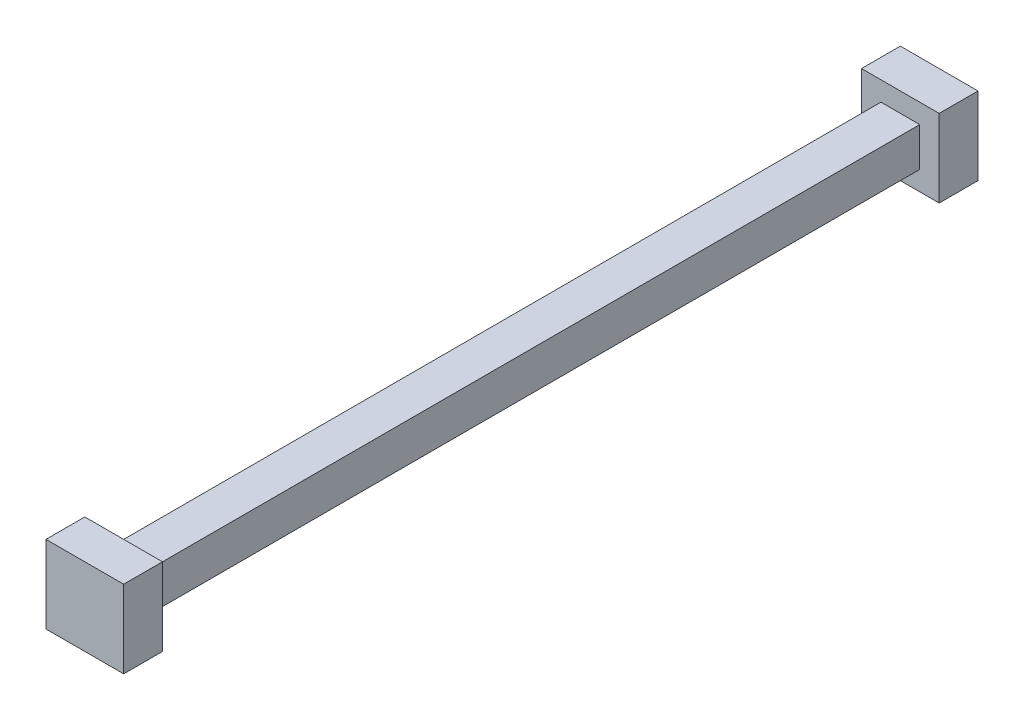
ISO-10303-21;
HEADER;
FILE_DESCRIPTION(('STEP AP214'),'2;1');
FILE_NAME('part.step','',(''),(''),'','','');
FILE_SCHEMA(('AUTOMOTIVE_DESIGN { 1 0 10303 214 1 1 1 1 }'));
ENDSEC;
DATA;
#1=APPLICATION_CONTEXT('core data for automotive mechanical design processes');
#2=APPLICATION_PROTOCOL_DEFINITION('international standard','automotive_design',2000,#1);
#3=PRODUCT_CONTEXT('',#1,'mechanical');
#4=PRODUCT('Part','Part','',(#3));
#5=PRODUCT_RELATED_PRODUCT_CATEGORY('part','',(#4));
#6=PRODUCT_DEFINITION_FORMATION('','',#4);
#7=PRODUCT_DEFINITION_CONTEXT('part definition',#1,'design');
#8=PRODUCT_DEFINITION('design','',#6,#7);
#9=PRODUCT_DEFINITION_SHAPE('','',#8);
#10=(LENGTH_UNIT() NAMED_UNIT(*) SI_UNIT(.MILLI.,.METRE.));
#11=(NAMED_UNIT(*) PLANE_ANGLE_UNIT() SI_UNIT($,.RADIAN.));
#12=(NAMED_UNIT(*) SI_UNIT($,.STERADIAN.) SOLID_ANGLE_UNIT());
#13=UNCERTAINTY_MEASURE_WITH_UNIT(LENGTH_MEASURE(1.E-05),#10,'distance_accuracy_value','');
#14=(GEOMETRIC_REPRESENTATION_CONTEXT(3) GLOBAL_UNCERTAINTY_ASSIGNED_CONTEXT((#13)) GLOBAL_UNIT_ASSIGNED_CONTEXT((#10,
#11,#12)) REPRESENTATION_CONTEXT('',''));
#15=CARTESIAN_POINT('',(0.,0.,0.));
#16=DIRECTION('',(0.,0.,1.));
#17=DIRECTION('',(1.,0.,0.));
#18=AXIS2_PLACEMENT_3D('',#15,#16,#17);
#19=CARTESIAN_POINT('',(5.,-5.,200.));
#20=DIRECTION('',(-1.,0.,0.));
#21=DIRECTION('',(0.,0.,1.));
#22=AXIS2_PLACEMENT_3D('',#19,#20,#21);
#23=PLANE('',#22);
#24=DIRECTION('',(0.,1.,0.));
#25=VECTOR('',#24,1.);
#26=CARTESIAN_POINT('',(5.,-5.,0.));
#27=LINE('',#26,#25);
#28=CARTESIAN_POINT('',(5.,-5.,0.));
#29=VERTEX_POINT('',#28);
#30=CARTESIAN_POINT('',(5.,5.,0.));
#31=VERTEX_POINT('',#30);
#32=EDGE_CURVE('E180',#29,#31,#27,.T.);
#33=ORIENTED_EDGE('',*,*,#32,.T.);
#34=DIRECTION('',(0.,0.,-1.));
#35=VECTOR('',#34,1.);
#36=CARTESIAN_POINT('',(5.,5.,200.));
#37=LINE('',#36,#35);
#38=CARTESIAN_POINT('',(5.,5.,200.));
#39=VERTEX_POINT('',#38);
#40=EDGE_CURVE('E11',#39,#31,#37,.T.);
#41=ORIENTED_EDGE('',*,*,#40,.F.);
#42=DIRECTION('',(0.,1.,0.));
#43=VECTOR('',#42,1.);
#44=CARTESIAN_POINT('',(5.,-5.,200.));
#45=LINE('',#44,#43);
#46=CARTESIAN_POINT('',(5.,-5.,200.));
#47=VERTEX_POINT('',#46);
#48=EDGE_CURVE('E181',#47,#39,#45,.T.);
#49=ORIENTED_EDGE('',*,*,#48,.F.);
#50=DIRECTION('',(0.,0.,-1.));
#51=VECTOR('',#50,1.);
#52=CARTESIAN_POINT('',(5.,-5.,200.));
#53=LINE('',#52,#51);
#54=EDGE_CURVE('E194',#47,#29,#53,.T.);
#55=ORIENTED_EDGE('',*,*,#54,.T.);
#56=EDGE_LOOP('',(#33,#41,#49,#55));
#57=FACE_BOUND('',#56,.T.);
#58=ADVANCED_FACE('F35',(#57),#23,.F.);
#59=CARTESIAN_POINT('',(-5.,5.,200.));
#60=DIRECTION('',(0.,-1.,0.));
#61=DIRECTION('',(0.,0.,-1.));
#62=AXIS2_PLACEMENT_3D('',#59,#60,#61);
#63=PLANE('',#62);
#64=DIRECTION('',(-1.,0.,0.));
#65=VECTOR('',#64,1.);
#66=CARTESIAN_POINT('',(-5.,5.,0.));
#67=LINE('',#66,#65);
#68=CARTESIAN_POINT('',(-5.,5.,0.));
#69=VERTEX_POINT('',#68);
#70=EDGE_CURVE('E197',#31,#69,#67,.T.);
#71=ORIENTED_EDGE('',*,*,#70,.T.);
#72=DIRECTION('',(0.,0.,-1.));
#73=VECTOR('',#72,1.);
#74=CARTESIAN_POINT('',(-5.,5.,200.));
#75=LINE('',#74,#73);
#76=CARTESIAN_POINT('',(-5.,5.,200.));
#77=VERTEX_POINT('',#76);
#78=EDGE_CURVE('E43',#77,#69,#75,.T.);
#79=ORIENTED_EDGE('',*,*,#78,.F.);
#80=DIRECTION('',(-1.,0.,0.));
#81=VECTOR('',#80,1.);
#82=CARTESIAN_POINT('',(-5.,5.,200.));
#83=LINE('',#82,#81);
#84=EDGE_CURVE('E184',#39,#77,#83,.T.);
#85=ORIENTED_EDGE('',*,*,#84,.F.);
#86=ORIENTED_EDGE('',*,*,#40,.T.);
#87=EDGE_LOOP('',(#71,#79,#85,#86));
#88=FACE_BOUND('',#87,.T.);
#89=ADVANCED_FACE('F210',(#88),#63,.F.);
#90=CARTESIAN_POINT('',(-5.,-5.,200.));
#91=DIRECTION('',(1.,0.,0.));
#92=DIRECTION('',(0.,0.,-1.));
#93=AXIS2_PLACEMENT_3D('',#90,#91,#92);
#94=PLANE('',#93);
#95=DIRECTION('',(0.,-1.,0.));
#96=VECTOR('',#95,1.);
#97=CARTESIAN_POINT('',(-5.,-5.,0.));
#98=LINE('',#97,#96);
#99=CARTESIAN_POINT('',(-5.,-5.,0.));
#100=VERTEX_POINT('',#99);
#101=EDGE_CURVE('E200',#69,#100,#98,.T.);
#102=ORIENTED_EDGE('',*,*,#101,.T.);
#103=DIRECTION('',(0.,0.,-1.));
#104=VECTOR('',#103,1.);
#105=CARTESIAN_POINT('',(-5.,-5.,200.));
#106=LINE('',#105,#104);
#107=CARTESIAN_POINT('',(-5.,-5.,200.));
#108=VERTEX_POINT('',#107);
#109=EDGE_CURVE('E50',#108,#100,#106,.T.);
#110=ORIENTED_EDGE('',*,*,#109,.F.);
#111=DIRECTION('',(0.,-1.,0.));
#112=VECTOR('',#111,1.);
#113=CARTESIAN_POINT('',(-5.,-5.,200.));
#114=LINE('',#113,#112);
#115=EDGE_CURVE('E188',#77,#108,#114,.T.);
#116=ORIENTED_EDGE('',*,*,#115,.F.);
#117=ORIENTED_EDGE('',*,*,#78,.T.);
#118=EDGE_LOOP('',(#102,#110,#116,#117));
#119=FACE_BOUND('',#118,.T.);
#120=ADVANCED_FACE('F207',(#119),#94,.F.);
#121=CARTESIAN_POINT('',(-5.,-5.,200.));
#122=DIRECTION('',(0.,1.,0.));
#123=DIRECTION('',(0.,0.,1.));
#124=AXIS2_PLACEMENT_3D('',#121,#122,#123);
#125=PLANE('',#124);
#126=DIRECTION('',(1.,0.,0.));
#127=VECTOR('',#126,1.);
#128=CARTESIAN_POINT('',(-5.,-5.,0.));
#129=LINE('',#128,#127);
#130=EDGE_CURVE('E185',#100,#29,#129,.T.);
#131=ORIENTED_EDGE('',*,*,#130,.T.);
#132=ORIENTED_EDGE('',*,*,#54,.F.);
#133=DIRECTION('',(1.,0.,0.));
#134=VECTOR('',#133,1.);
#135=CARTESIAN_POINT('',(-5.,-5.,200.));
#136=LINE('',#135,#134);
#137=EDGE_CURVE('E191',#108,#47,#136,.T.);
#138=ORIENTED_EDGE('',*,*,#137,.F.);
#139=ORIENTED_EDGE('',*,*,#109,.T.);
#140=EDGE_LOOP('',(#131,#132,#138,#139));
#141=FACE_BOUND('',#140,.T.);
#142=ADVANCED_FACE('F217',(#141),#125,.F.);
#143=CARTESIAN_POINT('',(10.,-10.,210.));
#144=DIRECTION('',(-1.,0.,0.));
#145=DIRECTION('',(0.,0.,1.));
#146=AXIS2_PLACEMENT_3D('',#143,#144,#145);
#147=PLANE('',#146);
#148=DIRECTION('',(0.,1.,0.));
#149=VECTOR('',#148,1.);
#150=CARTESIAN_POINT('',(10.,-10.,200.));
#151=LINE('',#150,#149);
#152=CARTESIAN_POINT('',(10.,-10.,200.));
#153=VERTEX_POINT('',#152);
#154=CARTESIAN_POINT('',(10.,10.,200.));
#155=VERTEX_POINT('',#154);
#156=EDGE_CURVE('E145',#153,#155,#151,.T.);
#157=ORIENTED_EDGE('',*,*,#156,.T.);
#158=DIRECTION('',(0.,0.,-1.));
#159=VECTOR('',#158,1.);
#160=CARTESIAN_POINT('',(10.,10.,210.));
#161=LINE('',#160,#159);
#162=CARTESIAN_POINT('',(10.,10.,210.));
#163=VERTEX_POINT('',#162);
#164=EDGE_CURVE('E177',#163,#155,#161,.T.);
#165=ORIENTED_EDGE('',*,*,#164,.F.);
#166=DIRECTION('',(0.,1.,0.));
#167=VECTOR('',#166,1.);
#168=CARTESIAN_POINT('',(10.,-10.,210.));
#169=LINE('',#168,#167);
#170=CARTESIAN_POINT('',(10.,-10.,210.));
#171=VERTEX_POINT('',#170);
#172=EDGE_CURVE('E154',#171,#163,#169,.T.);
#173=ORIENTED_EDGE('',*,*,#172,.F.);
#174=DIRECTION('',(0.,0.,-1.));
#175=VECTOR('',#174,1.);
#176=CARTESIAN_POINT('',(10.,-10.,210.));
#177=LINE('',#176,#175);
#178=EDGE_CURVE('E163',#171,#153,#177,.T.);
#179=ORIENTED_EDGE('',*,*,#178,.T.);
#180=EDGE_LOOP('',(#157,#165,#173,#179));
#181=FACE_BOUND('',#180,.T.);
#182=ADVANCED_FACE('F230',(#181),#147,.F.);
#183=CARTESIAN_POINT('',(-9.99999999999999,10.,210.));
#184=DIRECTION('',(0.,-1.,0.));
#185=DIRECTION('',(0.,0.,-1.));
#186=AXIS2_PLACEMENT_3D('',#183,#184,#185);
#187=PLANE('',#186);
#188=DIRECTION('',(-1.,0.,0.));
#189=VECTOR('',#188,1.);
#190=CARTESIAN_POINT('',(-9.99999999999999,10.,200.));
#191=LINE('',#190,#189);
#192=CARTESIAN_POINT('',(-9.99999999999999,10.,200.));
#193=VERTEX_POINT('',#192);
#194=EDGE_CURVE('E148',#155,#193,#191,.T.);
#195=ORIENTED_EDGE('',*,*,#194,.T.);
#196=DIRECTION('',(0.,0.,-1.));
#197=VECTOR('',#196,1.);
#198=CARTESIAN_POINT('',(-9.99999999999999,10.,210.));
#199=LINE('',#198,#197);
#200=CARTESIAN_POINT('',(-9.99999999999999,10.,210.));
#201=VERTEX_POINT('',#200);
#202=EDGE_CURVE('E174',#201,#193,#199,.T.);
#203=ORIENTED_EDGE('',*,*,#202,.F.);
#204=DIRECTION('',(-1.,0.,0.));
#205=VECTOR('',#204,1.);
#206=CARTESIAN_POINT('',(-9.99999999999999,10.,210.));
#207=LINE('',#206,#205);
#208=EDGE_CURVE('E157',#163,#201,#207,.T.);
#209=ORIENTED_EDGE('',*,*,#208,.F.);
#210=ORIENTED_EDGE('',*,*,#164,.T.);
#211=EDGE_LOOP('',(#195,#203,#209,#210));
#212=FACE_BOUND('',#211,.T.);
#213=ADVANCED_FACE('F242',(#212),#187,.F.);
#214=CARTESIAN_POINT('',(-9.99999999999999,-10.,210.));
#215=DIRECTION('',(1.,0.,0.));
#216=DIRECTION('',(0.,0.,-1.));
#217=AXIS2_PLACEMENT_3D('',#214,#215,#216);
#218=PLANE('',#217);
#219=DIRECTION('',(0.,-1.,0.));
#220=VECTOR('',#219,1.);
#221=CARTESIAN_POINT('',(-9.99999999999999,-10.,200.));
#222=LINE('',#221,#220);
#223=CARTESIAN_POINT('',(-9.99999999999999,-10.,200.));
#224=VERTEX_POINT('',#223);
#225=EDGE_CURVE('E166',#193,#224,#222,.T.);
#226=ORIENTED_EDGE('',*,*,#225,.T.);
#227=DIRECTION('',(0.,0.,-1.));
#228=VECTOR('',#227,1.);
#229=CARTESIAN_POINT('',(-9.99999999999999,-10.,210.));
#230=LINE('',#229,#228);
#231=CARTESIAN_POINT('',(-9.99999999999999,-10.,210.));
#232=VERTEX_POINT('',#231);
#233=EDGE_CURVE('E171',#232,#224,#230,.T.);
#234=ORIENTED_EDGE('',*,*,#233,.F.);
#235=DIRECTION('',(0.,-1.,0.));
#236=VECTOR('',#235,1.);
#237=CARTESIAN_POINT('',(-9.99999999999999,-10.,210.));
#238=LINE('',#237,#236);
#239=EDGE_CURVE('E160',#201,#232,#238,.T.);
#240=ORIENTED_EDGE('',*,*,#239,.F.);
#241=ORIENTED_EDGE('',*,*,#202,.T.);
#242=EDGE_LOOP('',(#226,#234,#240,#241));
#243=FACE_BOUND('',#242,.T.);
#244=ADVANCED_FACE('F239',(#243),#218,.F.);
#245=CARTESIAN_POINT('',(-9.99999999999999,-10.,210.));
#246=DIRECTION('',(0.,1.,0.));
#247=DIRECTION('',(0.,0.,1.));
#248=AXIS2_PLACEMENT_3D('',#245,#246,#247);
#249=PLANE('',#248);
#250=DIRECTION('',(1.,0.,0.));
#251=VECTOR('',#250,1.);
#252=CARTESIAN_POINT('',(-9.99999999999999,-10.,200.));
#253=LINE('',#252,#251);
#254=EDGE_CURVE('E158',#224,#153,#253,.T.);
#255=ORIENTED_EDGE('',*,*,#254,.T.);
#256=ORIENTED_EDGE('',*,*,#178,.F.);
#257=DIRECTION('',(1.,0.,0.));
#258=VECTOR('',#257,1.);
#259=CARTESIAN_POINT('',(-9.99999999999999,-10.,210.));
#260=LINE('',#259,#258);
#261=EDGE_CURVE('E162',#232,#171,#260,.T.);
#262=ORIENTED_EDGE('',*,*,#261,.F.);
#263=ORIENTED_EDGE('',*,*,#233,.T.);
#264=EDGE_LOOP('',(#255,#256,#262,#263));
#265=FACE_BOUND('',#264,.T.);
#266=ADVANCED_FACE('F235',(#265),#249,.F.);
#267=CARTESIAN_POINT('',(0.,0.,210.));
#268=DIRECTION('',(0.,0.,-1.));
#269=DIRECTION('',(-1.,0.,0.));
#270=AXIS2_PLACEMENT_3D('',#267,#268,#269);
#271=PLANE('',#270);
#272=ORIENTED_EDGE('',*,*,#172,.T.);
#273=ORIENTED_EDGE('',*,*,#208,.T.);
#274=ORIENTED_EDGE('',*,*,#239,.T.);
#275=ORIENTED_EDGE('',*,*,#261,.T.);
#276=EDGE_LOOP('',(#272,#273,#274,#275));
#277=FACE_BOUND('',#276,.T.);
#278=ADVANCED_FACE('F223',(#277),#271,.F.);
#279=CARTESIAN_POINT('',(0.,0.,200.));
#280=DIRECTION('',(0.,0.,-1.));
#281=DIRECTION('',(-1.,0.,0.));
#282=AXIS2_PLACEMENT_3D('',#279,#280,#281);
#283=PLANE('',#282);
#284=ORIENTED_EDGE('',*,*,#137,.T.);
#285=ORIENTED_EDGE('',*,*,#48,.T.);
#286=ORIENTED_EDGE('',*,*,#84,.T.);
#287=ORIENTED_EDGE('',*,*,#115,.T.);
#288=EDGE_LOOP('',(#284,#285,#286,#287));
#289=FACE_BOUND('',#288,.T.);
#290=ORIENTED_EDGE('',*,*,#156,.F.);
#291=ORIENTED_EDGE('',*,*,#254,.F.);
#292=ORIENTED_EDGE('',*,*,#225,.F.);
#293=ORIENTED_EDGE('',*,*,#194,.F.);
#294=EDGE_LOOP('',(#290,#291,#292,#293));
#295=FACE_BOUND('',#294,.T.);
#296=ADVANCED_FACE('F220',(#289,#295),#283,.T.);
#297=CARTESIAN_POINT('',(-10.,10.,-10.));
#298=DIRECTION('',(1.,0.,0.));
#299=DIRECTION('',(0.,1.,0.));
#300=AXIS2_PLACEMENT_3D('',#297,#298,#299);
#301=PLANE('',#300);
#302=DIRECTION('',(0.,1.,0.));
#303=VECTOR('',#302,1.);
#304=CARTESIAN_POINT('',(-10.,10.,0.));
#305=LINE('',#304,#303);
#306=CARTESIAN_POINT('',(-10.,-10.,0.));
#307=VERTEX_POINT('',#306);
#308=CARTESIAN_POINT('',(-10.,10.,0.));
#309=VERTEX_POINT('',#308);
#310=EDGE_CURVE('E144',#307,#309,#305,.T.);
#311=ORIENTED_EDGE('',*,*,#310,.T.);
#312=DIRECTION('',(0.,0.,1.));
#313=VECTOR('',#312,1.);
#314=CARTESIAN_POINT('',(-10.,10.,-10.));
#315=LINE('',#314,#313);
#316=CARTESIAN_POINT('',(-10.,10.,-10.));
#317=VERTEX_POINT('',#316);
#318=EDGE_CURVE('E124',#317,#309,#315,.T.);
#319=ORIENTED_EDGE('',*,*,#318,.F.);
#320=DIRECTION('',(0.,1.,0.));
#321=VECTOR('',#320,1.);
#322=CARTESIAN_POINT('',(-10.,10.,-10.));
#323=LINE('',#322,#321);
#324=CARTESIAN_POINT('',(-10.,-10.,-10.));
#325=VERTEX_POINT('',#324);
#326=EDGE_CURVE('E131',#325,#317,#323,.T.);
#327=ORIENTED_EDGE('',*,*,#326,.F.);
#328=DIRECTION('',(0.,0.,1.));
#329=VECTOR('',#328,1.);
#330=CARTESIAN_POINT('',(-10.,-10.,-10.));
#331=LINE('',#330,#329);
#332=EDGE_CURVE('E363',#325,#307,#331,.T.);
#333=ORIENTED_EDGE('',*,*,#332,.T.);
#334=EDGE_LOOP('',(#311,#319,#327,#333));
#335=FACE_BOUND('',#334,.T.);
#336=ADVANCED_FACE('F142',(#335),#301,.F.);
#337=CARTESIAN_POINT('',(10.,10.,-10.));
#338=DIRECTION('',(0.,-1.,0.));
#339=DIRECTION('',(0.,0.,-1.));
#340=AXIS2_PLACEMENT_3D('',#337,#338,#339);
#341=PLANE('',#340);
#342=DIRECTION('',(1.,0.,0.));
#343=VECTOR('',#342,1.);
#344=CARTESIAN_POINT('',(10.,10.,0.));
#345=LINE('',#344,#343);
#346=CARTESIAN_POINT('',(10.,10.,0.));
#347=VERTEX_POINT('',#346);
#348=EDGE_CURVE('E369',#309,#347,#345,.T.);
#349=ORIENTED_EDGE('',*,*,#348,.T.);
#350=DIRECTION('',(0.,0.,1.));
#351=VECTOR('',#350,1.);
#352=CARTESIAN_POINT('',(10.,10.,-10.));
#353=LINE('',#352,#351);
#354=CARTESIAN_POINT('',(10.,10.,-10.));
#355=VERTEX_POINT('',#354);
#356=EDGE_CURVE('E127',#355,#347,#353,.T.);
#357=ORIENTED_EDGE('',*,*,#356,.F.);
#358=DIRECTION('',(1.,0.,0.));
#359=VECTOR('',#358,1.);
#360=CARTESIAN_POINT('',(10.,10.,-10.));
#361=LINE('',#360,#359);
#362=EDGE_CURVE('E120',#317,#355,#361,.T.);
#363=ORIENTED_EDGE('',*,*,#362,.F.);
#364=ORIENTED_EDGE('',*,*,#318,.T.);
#365=EDGE_LOOP('',(#349,#357,#363,#364));
#366=FACE_BOUND('',#365,.T.);
#367=ADVANCED_FACE('F122',(#366),#341,.F.);
#368=CARTESIAN_POINT('',(10.,10.,-10.));
#369=DIRECTION('',(-1.,0.,0.));
#370=DIRECTION('',(0.,-1.,0.));
#371=AXIS2_PLACEMENT_3D('',#368,#369,#370);
#372=PLANE('',#371);
#373=DIRECTION('',(0.,-1.,0.));
#374=VECTOR('',#373,1.);
#375=CARTESIAN_POINT('',(10.,10.,0.));
#376=LINE('',#375,#374);
#377=CARTESIAN_POINT('',(10.,-10.,0.));
#378=VERTEX_POINT('',#377);
#379=EDGE_CURVE('E366',#347,#378,#376,.T.);
#380=ORIENTED_EDGE('',*,*,#379,.T.);
#381=DIRECTION('',(0.,0.,1.));
#382=VECTOR('',#381,1.);
#383=CARTESIAN_POINT('',(10.,-10.,-10.));
#384=LINE('',#383,#382);
#385=CARTESIAN_POINT('',(10.,-10.,-10.));
#386=VERTEX_POINT('',#385);
#387=EDGE_CURVE('E150',#386,#378,#384,.T.);
#388=ORIENTED_EDGE('',*,*,#387,.F.);
#389=DIRECTION('',(0.,-1.,0.));
#390=VECTOR('',#389,1.);
#391=CARTESIAN_POINT('',(10.,10.,-10.));
#392=LINE('',#391,#390);
#393=EDGE_CURVE('E130',#355,#386,#392,.T.);
#394=ORIENTED_EDGE('',*,*,#393,.F.);
#395=ORIENTED_EDGE('',*,*,#356,.T.);
#396=EDGE_LOOP('',(#380,#388,#394,#395));
#397=FACE_BOUND('',#396,.T.);
#398=ADVANCED_FACE('F322',(#397),#372,.F.);
#399=CARTESIAN_POINT('',(10.,-10.,-10.));
#400=DIRECTION('',(0.,1.,0.));
#401=DIRECTION('',(0.,0.,1.));
#402=AXIS2_PLACEMENT_3D('',#399,#400,#401);
#403=PLANE('',#402);
#404=DIRECTION('',(-1.,0.,0.));
#405=VECTOR('',#404,1.);
#406=CARTESIAN_POINT('',(10.,-10.,0.));
#407=LINE('',#406,#405);
#408=EDGE_CURVE('E140',#378,#307,#407,.T.);
#409=ORIENTED_EDGE('',*,*,#408,.T.);
#410=ORIENTED_EDGE('',*,*,#332,.F.);
#411=DIRECTION('',(-1.,0.,0.));
#412=VECTOR('',#411,1.);
#413=CARTESIAN_POINT('',(10.,-10.,-10.));
#414=LINE('',#413,#412);
#415=EDGE_CURVE('E136',#386,#325,#414,.T.);
#416=ORIENTED_EDGE('',*,*,#415,.F.);
#417=ORIENTED_EDGE('',*,*,#387,.T.);
#418=EDGE_LOOP('',(#409,#410,#416,#417));
#419=FACE_BOUND('',#418,.T.);
#420=ADVANCED_FACE('F331',(#419),#403,.F.);
#421=CARTESIAN_POINT('',(0.,0.,-10.));
#422=DIRECTION('',(0.,0.,-1.));
#423=DIRECTION('',(-1.,0.,0.));
#424=AXIS2_PLACEMENT_3D('',#421,#422,#423);
#425=PLANE('',#424);
#426=ORIENTED_EDGE('',*,*,#326,.T.);
#427=ORIENTED_EDGE('',*,*,#362,.T.);
#428=ORIENTED_EDGE('',*,*,#393,.T.);
#429=ORIENTED_EDGE('',*,*,#415,.T.);
#430=EDGE_LOOP('',(#426,#427,#428,#429));
#431=FACE_BOUND('',#430,.T.);
#432=ADVANCED_FACE('F134',(#431),#425,.T.);
#433=CARTESIAN_POINT('',(0.,0.,0.));
#434=DIRECTION('',(0.,0.,-1.));
#435=DIRECTION('',(-1.,0.,0.));
#436=AXIS2_PLACEMENT_3D('',#433,#434,#435);
#437=PLANE('',#436);
#438=ORIENTED_EDGE('',*,*,#32,.F.);
#439=ORIENTED_EDGE('',*,*,#130,.F.);
#440=ORIENTED_EDGE('',*,*,#101,.F.);
#441=ORIENTED_EDGE('',*,*,#70,.F.);
#442=EDGE_LOOP('',(#438,#439,#440,#441));
#443=FACE_BOUND('',#442,.T.);
#444=ORIENTED_EDGE('',*,*,#310,.F.);
#445=ORIENTED_EDGE('',*,*,#408,.F.);
#446=ORIENTED_EDGE('',*,*,#379,.F.);
#447=ORIENTED_EDGE('',*,*,#348,.F.);
#448=EDGE_LOOP('',(#444,#445,#446,#447));
#449=FACE_BOUND('',#448,.T.);
#450=ADVANCED_FACE('F213',(#443,#449),#437,.F.);
#451=CLOSED_SHELL('',(#58,#89,#120,#142,#182,#213,#244,#266,#278,#296,#336,#367,#398,#420,#432,#450));
#452=MANIFOLD_SOLID_BREP('B2',#451);
#453=ADVANCED_BREP_SHAPE_REPRESENTATION('',(#18,#452),#14);
#454=SHAPE_DEFINITION_REPRESENTATION(#9,#453);
ENDSEC;
END-ISO-10303-21;
